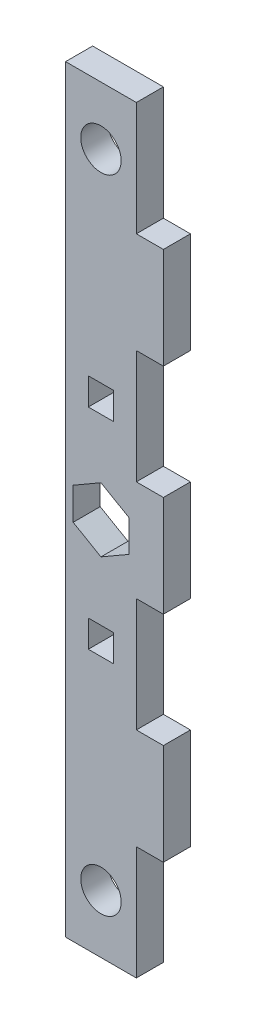
ISO-10303-21;
HEADER;
FILE_DESCRIPTION(('STEP AP214'),'2;1');
FILE_NAME('part.step','',(''),(''),'','','');
FILE_SCHEMA(('AUTOMOTIVE_DESIGN { 1 0 10303 214 1 1 1 1 }'));
ENDSEC;
DATA;
#1=APPLICATION_CONTEXT('core data for automotive mechanical design processes');
#2=APPLICATION_PROTOCOL_DEFINITION('international standard','automotive_design',2000,#1);
#3=PRODUCT_CONTEXT('',#1,'mechanical');
#4=PRODUCT('Part','Part','',(#3));
#5=PRODUCT_RELATED_PRODUCT_CATEGORY('part','',(#4));
#6=PRODUCT_DEFINITION_FORMATION('','',#4);
#7=PRODUCT_DEFINITION_CONTEXT('part definition',#1,'design');
#8=PRODUCT_DEFINITION('design','',#6,#7);
#9=PRODUCT_DEFINITION_SHAPE('','',#8);
#10=(LENGTH_UNIT() NAMED_UNIT(*) SI_UNIT(.MILLI.,.METRE.));
#11=(NAMED_UNIT(*) PLANE_ANGLE_UNIT() SI_UNIT($,.RADIAN.));
#12=(NAMED_UNIT(*) SI_UNIT($,.STERADIAN.) SOLID_ANGLE_UNIT());
#13=UNCERTAINTY_MEASURE_WITH_UNIT(LENGTH_MEASURE(1.E-05),#10,'distance_accuracy_value','');
#14=(GEOMETRIC_REPRESENTATION_CONTEXT(3) GLOBAL_UNCERTAINTY_ASSIGNED_CONTEXT((#13)) GLOBAL_UNIT_ASSIGNED_CONTEXT((#10,
#11,#12)) REPRESENTATION_CONTEXT('',''));
#15=CARTESIAN_POINT('',(0.,0.,0.));
#16=DIRECTION('',(0.,0.,1.));
#17=DIRECTION('',(1.,0.,0.));
#18=AXIS2_PLACEMENT_3D('',#15,#16,#17);
#19=CARTESIAN_POINT('',(0.,0.,5.35));
#20=DIRECTION('',(0.,0.,-1.));
#21=DIRECTION('',(-1.,0.,0.));
#22=AXIS2_PLACEMENT_3D('',#19,#20,#21);
#23=PLANE('',#22);
#24=DIRECTION('',(0.,1.,0.));
#25=VECTOR('',#24,1.);
#26=CARTESIAN_POINT('',(9.49999969450005,93.0749997497,5.35));
#27=LINE('',#26,#25);
#28=CARTESIAN_POINT('',(9.49999969450005,93.0749997497,5.35));
#29=VERTEX_POINT('',#28);
#30=CARTESIAN_POINT('',(9.49999969450005,98.425000906,5.35));
#31=VERTEX_POINT('',#30);
#32=EDGE_CURVE('E281',#29,#31,#27,.T.);
#33=ORIENTED_EDGE('',*,*,#32,.F.);
#34=DIRECTION('',(1.,0.,0.));
#35=VECTOR('',#34,1.);
#36=CARTESIAN_POINT('',(4.49999980630006,93.0749997497,5.35));
#37=LINE('',#36,#35);
#38=CARTESIAN_POINT('',(4.49999980630006,93.0749997497,5.35));
#39=VERTEX_POINT('',#38);
#40=EDGE_CURVE('E289',#39,#29,#37,.T.);
#41=ORIENTED_EDGE('',*,*,#40,.F.);
#42=DIRECTION('',(0.,-1.,0.));
#43=VECTOR('',#42,1.);
#44=CARTESIAN_POINT('',(4.49999980630006,98.425000906,5.35));
#45=LINE('',#44,#43);
#46=CARTESIAN_POINT('',(4.49999980630006,98.425000906,5.35));
#47=VERTEX_POINT('',#46);
#48=EDGE_CURVE('E286',#47,#39,#45,.T.);
#49=ORIENTED_EDGE('',*,*,#48,.F.);
#50=DIRECTION('',(-1.,0.,0.));
#51=VECTOR('',#50,1.);
#52=CARTESIAN_POINT('',(9.49999969450005,98.425000906,5.35));
#53=LINE('',#52,#51);
#54=EDGE_CURVE('E283',#31,#47,#53,.T.);
#55=ORIENTED_EDGE('',*,*,#54,.F.);
#56=EDGE_LOOP('',(#33,#41,#49,#55));
#57=FACE_BOUND('',#56,.T.);
#58=CARTESIAN_POINT('',(7.00000000000006,138.5,5.35));
#59=DIRECTION('',(0.,0.,1.));
#60=DIRECTION('',(1.,0.,0.));
#61=AXIS2_PLACEMENT_3D('',#58,#59,#60);
#62=CIRCLE('',#61,4.);
#63=CARTESIAN_POINT('',(11.0000000000001,138.5,5.35));
#64=VERTEX_POINT('',#63);
#65=EDGE_CURVE('E343',#64,#64,#62,.T.);
#66=ORIENTED_EDGE('',*,*,#65,.F.);
#67=EDGE_LOOP('',(#66));
#68=FACE_BOUND('',#67,.T.);
#69=CARTESIAN_POINT('',(7.00000000000006,11.5,5.35));
#70=DIRECTION('',(0.,0.,1.));
#71=DIRECTION('',(1.,0.,0.));
#72=AXIS2_PLACEMENT_3D('',#69,#70,#71);
#73=CIRCLE('',#72,4.);
#74=CARTESIAN_POINT('',(11.0000000000001,11.5,5.35));
#75=VERTEX_POINT('',#74);
#76=EDGE_CURVE('E349',#75,#75,#73,.T.);
#77=ORIENTED_EDGE('',*,*,#76,.F.);
#78=EDGE_LOOP('',(#77));
#79=FACE_BOUND('',#78,.T.);
#80=DIRECTION('',(-1.,0.,0.));
#81=VECTOR('',#80,1.);
#82=CARTESIAN_POINT('',(19.3499997258,127.4999976158,5.35));
#83=LINE('',#82,#81);
#84=CARTESIAN_POINT('',(19.3499997258,127.4999976158,5.35));
#85=VERTEX_POINT('',#84);
#86=CARTESIAN_POINT('',(14.0000004321001,127.4999976158,5.35));
#87=VERTEX_POINT('',#86);
#88=EDGE_CURVE('E355',#85,#87,#83,.T.);
#89=ORIENTED_EDGE('',*,*,#88,.T.);
#90=DIRECTION('',(0.,1.,0.));
#91=VECTOR('',#90,1.);
#92=CARTESIAN_POINT('',(14.0000004321001,127.4999976158,5.35));
#93=LINE('',#92,#91);
#94=CARTESIAN_POINT('',(14.0000004321001,150.0000059605,5.35));
#95=VERTEX_POINT('',#94);
#96=EDGE_CURVE('E358',#87,#95,#93,.T.);
#97=ORIENTED_EDGE('',*,*,#96,.T.);
#98=DIRECTION('',(-1.,0.,0.));
#99=VECTOR('',#98,1.);
#100=CARTESIAN_POINT('',(14.0000004321001,150.0000059605,5.35));
#101=LINE('',#100,#99);
#102=CARTESIAN_POINT('',(0.,150.0000059605,5.35));
#103=VERTEX_POINT('',#102);
#104=EDGE_CURVE('E361',#95,#103,#101,.T.);
#105=ORIENTED_EDGE('',*,*,#104,.T.);
#106=DIRECTION('',(0.,-1.,0.));
#107=VECTOR('',#106,1.);
#108=CARTESIAN_POINT('',(0.,150.0000059605,5.35));
#109=LINE('',#108,#107);
#110=CARTESIAN_POINT('',(0.,0.,5.35));
#111=VERTEX_POINT('',#110);
#112=EDGE_CURVE('E363',#103,#111,#109,.T.);
#113=ORIENTED_EDGE('',*,*,#112,.T.);
#114=DIRECTION('',(1.,0.,0.));
#115=VECTOR('',#114,1.);
#116=CARTESIAN_POINT('',(0.,0.,5.35));
#117=LINE('',#116,#115);
#118=CARTESIAN_POINT('',(14.0000004321001,0.,5.35));
#119=VERTEX_POINT('',#118);
#120=EDGE_CURVE('E365',#111,#119,#117,.T.);
#121=ORIENTED_EDGE('',*,*,#120,.T.);
#122=DIRECTION('',(0.,1.,0.));
#123=VECTOR('',#122,1.);
#124=CARTESIAN_POINT('',(14.0000004321001,0.,5.35));
#125=LINE('',#124,#123);
#126=CARTESIAN_POINT('',(14.0000004321001,22.5000008941,5.35));
#127=VERTEX_POINT('',#126);
#128=EDGE_CURVE('E367',#119,#127,#125,.T.);
#129=ORIENTED_EDGE('',*,*,#128,.T.);
#130=DIRECTION('',(1.,0.,0.));
#131=VECTOR('',#130,1.);
#132=CARTESIAN_POINT('',(14.0000004321001,22.5000008941,5.35));
#133=LINE('',#132,#131);
#134=CARTESIAN_POINT('',(19.3499997258,22.5000008941,5.35));
#135=VERTEX_POINT('',#134);
#136=EDGE_CURVE('E369',#127,#135,#133,.T.);
#137=ORIENTED_EDGE('',*,*,#136,.T.);
#138=DIRECTION('',(0.,1.,0.));
#139=VECTOR('',#138,1.);
#140=CARTESIAN_POINT('',(19.3499997258,22.5000008941,5.35));
#141=LINE('',#140,#139);
#142=CARTESIAN_POINT('',(19.3499997258,42.500000447,5.35));
#143=VERTEX_POINT('',#142);
#144=EDGE_CURVE('E371',#135,#143,#141,.T.);
#145=ORIENTED_EDGE('',*,*,#144,.T.);
#146=DIRECTION('',(-1.,0.,0.));
#147=VECTOR('',#146,1.);
#148=CARTESIAN_POINT('',(19.3499997258,42.500000447,5.35));
#149=LINE('',#148,#147);
#150=CARTESIAN_POINT('',(14.0000004321001,42.500000447,5.35));
#151=VERTEX_POINT('',#150);
#152=EDGE_CURVE('E373',#143,#151,#149,.T.);
#153=ORIENTED_EDGE('',*,*,#152,.T.);
#154=DIRECTION('',(0.,1.,0.));
#155=VECTOR('',#154,1.);
#156=CARTESIAN_POINT('',(14.0000004321001,42.500000447,5.35));
#157=LINE('',#156,#155);
#158=CARTESIAN_POINT('',(14.0000004321001,64.9999976158,5.35));
#159=VERTEX_POINT('',#158);
#160=EDGE_CURVE('E375',#151,#159,#157,.T.);
#161=ORIENTED_EDGE('',*,*,#160,.T.);
#162=DIRECTION('',(1.,0.,0.));
#163=VECTOR('',#162,1.);
#164=CARTESIAN_POINT('',(14.0000004321001,64.9999976158,5.35));
#165=LINE('',#164,#163);
#166=CARTESIAN_POINT('',(19.3499997258,64.9999976158,5.35));
#167=VERTEX_POINT('',#166);
#168=EDGE_CURVE('E377',#159,#167,#165,.T.);
#169=ORIENTED_EDGE('',*,*,#168,.T.);
#170=DIRECTION('',(0.,1.,0.));
#171=VECTOR('',#170,1.);
#172=CARTESIAN_POINT('',(19.3499997258,64.9999976158,5.35));
#173=LINE('',#172,#171);
#174=CARTESIAN_POINT('',(19.3499997258,85.0000008941,5.35));
#175=VERTEX_POINT('',#174);
#176=EDGE_CURVE('E379',#167,#175,#173,.T.);
#177=ORIENTED_EDGE('',*,*,#176,.T.);
#178=DIRECTION('',(-1.,0.,0.));
#179=VECTOR('',#178,1.);
#180=CARTESIAN_POINT('',(19.3499997258,85.0000008941,5.35));
#181=LINE('',#180,#179);
#182=CARTESIAN_POINT('',(14.0000004321001,85.0000008941,5.35));
#183=VERTEX_POINT('',#182);
#184=EDGE_CURVE('E381',#175,#183,#181,.T.);
#185=ORIENTED_EDGE('',*,*,#184,.T.);
#186=DIRECTION('',(0.,1.,0.));
#187=VECTOR('',#186,1.);
#188=CARTESIAN_POINT('',(14.0000004321001,85.0000008941,5.35));
#189=LINE('',#188,#187);
#190=CARTESIAN_POINT('',(14.0000004321001,107.5000017881,5.35));
#191=VERTEX_POINT('',#190);
#192=EDGE_CURVE('E383',#183,#191,#189,.T.);
#193=ORIENTED_EDGE('',*,*,#192,.T.);
#194=DIRECTION('',(1.,0.,0.));
#195=VECTOR('',#194,1.);
#196=CARTESIAN_POINT('',(14.0000004321001,107.5000017881,5.35));
#197=LINE('',#196,#195);
#198=CARTESIAN_POINT('',(19.3499997258,107.5000017881,5.35));
#199=VERTEX_POINT('',#198);
#200=EDGE_CURVE('E385',#191,#199,#197,.T.);
#201=ORIENTED_EDGE('',*,*,#200,.T.);
#202=DIRECTION('',(0.,1.,0.));
#203=VECTOR('',#202,1.);
#204=CARTESIAN_POINT('',(19.3499997258,107.5000017881,5.35));
#205=LINE('',#204,#203);
#206=EDGE_CURVE('E387',#199,#85,#205,.T.);
#207=ORIENTED_EDGE('',*,*,#206,.T.);
#208=EDGE_LOOP('',(#89,#97,#105,#113,#121,#129,#137,#145,#153,#161,#169,#177,#185,#193,#201,#207));
#209=FACE_BOUND('',#208,.T.);
#210=DIRECTION('',(0.,-1.,0.));
#211=VECTOR('',#210,1.);
#212=CARTESIAN_POINT('',(4.49999980630006,56.9249987602,5.35));
#213=LINE('',#212,#211);
#214=CARTESIAN_POINT('',(4.49999980630006,56.9249987602,5.35));
#215=VERTEX_POINT('',#214);
#216=CARTESIAN_POINT('',(4.49999980630006,51.5750013292,5.35));
#217=VERTEX_POINT('',#216);
#218=EDGE_CURVE('E312',#215,#217,#213,.T.);
#219=ORIENTED_EDGE('',*,*,#218,.F.);
#220=DIRECTION('',(-1.,0.,0.));
#221=VECTOR('',#220,1.);
#222=CARTESIAN_POINT('',(9.49999969450005,56.9249987602,5.35));
#223=LINE('',#222,#221);
#224=CARTESIAN_POINT('',(9.49999969450005,56.9249987602,5.35));
#225=VERTEX_POINT('',#224);
#226=EDGE_CURVE('E320',#225,#215,#223,.T.);
#227=ORIENTED_EDGE('',*,*,#226,.F.);
#228=DIRECTION('',(0.,1.,0.));
#229=VECTOR('',#228,1.);
#230=CARTESIAN_POINT('',(9.49999969450005,51.5750013292,5.35));
#231=LINE('',#230,#229);
#232=CARTESIAN_POINT('',(9.49999969450005,51.5750013292,5.35));
#233=VERTEX_POINT('',#232);
#234=EDGE_CURVE('E317',#233,#225,#231,.T.);
#235=ORIENTED_EDGE('',*,*,#234,.F.);
#236=DIRECTION('',(1.,0.,0.));
#237=VECTOR('',#236,1.);
#238=CARTESIAN_POINT('',(4.49999980630006,51.5750013292,5.35));
#239=LINE('',#238,#237);
#240=EDGE_CURVE('E314',#217,#233,#239,.T.);
#241=ORIENTED_EDGE('',*,*,#240,.F.);
#242=EDGE_LOOP('',(#219,#227,#235,#241));
#243=FACE_BOUND('',#242,.T.);
#244=DIRECTION('',(0.,-1.,0.));
#245=VECTOR('',#244,1.);
#246=CARTESIAN_POINT('',(1.50000001299999,78.1754255295,5.35));
#247=LINE('',#246,#245);
#248=CARTESIAN_POINT('',(1.50000001299999,78.1754255295,5.35));
#249=VERTEX_POINT('',#248);
#250=CARTESIAN_POINT('',(1.50000001299999,71.8245729804,5.35));
#251=VERTEX_POINT('',#250);
#252=EDGE_CURVE('E230',#249,#251,#247,.T.);
#253=ORIENTED_EDGE('',*,*,#252,.F.);
#254=DIRECTION('',(-0.86602517183006,-0.500000401756554,0.));
#255=VECTOR('',#254,1.);
#256=CARTESIAN_POINT('',(7.00000021610003,81.3508555293,5.35));
#257=LINE('',#256,#255);
#258=CARTESIAN_POINT('',(7.00000021610003,81.3508555293,5.35));
#259=VERTEX_POINT('',#258);
#260=EDGE_CURVE('E259',#259,#249,#257,.T.);
#261=ORIENTED_EDGE('',*,*,#260,.F.);
#262=DIRECTION('',(-0.866025162661986,0.500000417636106,0.));
#263=VECTOR('',#262,1.);
#264=CARTESIAN_POINT('',(12.5000001863,78.1754255295,5.35));
#265=LINE('',#264,#263);
#266=CARTESIAN_POINT('',(12.5000001863,78.1754255295,5.35));
#267=VERTEX_POINT('',#266);
#268=EDGE_CURVE('E257',#267,#259,#265,.T.);
#269=ORIENTED_EDGE('',*,*,#268,.F.);
#270=DIRECTION('',(0.,1.,0.));
#271=VECTOR('',#270,1.);
#272=CARTESIAN_POINT('',(12.5000001863,71.8245729804,5.35));
#273=LINE('',#272,#271);
#274=CARTESIAN_POINT('',(12.5000001863,71.8245729804,5.35));
#275=VERTEX_POINT('',#274);
#276=EDGE_CURVE('E253',#275,#267,#273,.T.);
#277=ORIENTED_EDGE('',*,*,#276,.F.);
#278=DIRECTION('',(0.866025670657436,0.499999537762125,0.));
#279=VECTOR('',#278,1.);
#280=CARTESIAN_POINT('',(7.00000021610009,68.6491504312,5.35));
#281=LINE('',#280,#279);
#282=CARTESIAN_POINT('',(7.00000021610009,68.6491504312,5.35));
#283=VERTEX_POINT('',#282);
#284=EDGE_CURVE('E251',#283,#275,#281,.T.);
#285=ORIENTED_EDGE('',*,*,#284,.F.);
#286=DIRECTION('',(0.866025679825487,-0.499999521882575,0.));
#287=VECTOR('',#286,1.);
#288=CARTESIAN_POINT('',(1.50000001299999,71.8245729804,5.35));
#289=LINE('',#288,#287);
#290=EDGE_CURVE('E238',#251,#283,#289,.T.);
#291=ORIENTED_EDGE('',*,*,#290,.F.);
#292=EDGE_LOOP('',(#253,#261,#269,#277,#285,#291));
#293=FACE_BOUND('',#292,.T.);
#294=ADVANCED_FACE('F33',(#57,#68,#79,#209,#243,#293),#23,.F.);
#295=CARTESIAN_POINT('',(0.,0.,0.));
#296=DIRECTION('',(0.,0.,-1.));
#297=DIRECTION('',(-1.,0.,0.));
#298=AXIS2_PLACEMENT_3D('',#295,#296,#297);
#299=PLANE('',#298);
#300=CARTESIAN_POINT('',(7.00000000000006,11.5,0.));
#301=DIRECTION('',(0.,0.,1.));
#302=DIRECTION('',(1.,0.,0.));
#303=AXIS2_PLACEMENT_3D('',#300,#301,#302);
#304=CIRCLE('',#303,4.);
#305=CARTESIAN_POINT('',(11.0000000000001,11.5,0.));
#306=VERTEX_POINT('',#305);
#307=EDGE_CURVE('E346',#306,#306,#304,.T.);
#308=ORIENTED_EDGE('',*,*,#307,.T.);
#309=EDGE_LOOP('',(#308));
#310=FACE_BOUND('',#309,.T.);
#311=DIRECTION('',(-1.,0.,0.));
#312=VECTOR('',#311,1.);
#313=CARTESIAN_POINT('',(19.3499997258,127.4999976158,0.));
#314=LINE('',#313,#312);
#315=CARTESIAN_POINT('',(19.3499997258,127.4999976158,0.));
#316=VERTEX_POINT('',#315);
#317=CARTESIAN_POINT('',(14.0000004321001,127.4999976158,0.));
#318=VERTEX_POINT('',#317);
#319=EDGE_CURVE('E352',#316,#318,#314,.T.);
#320=ORIENTED_EDGE('',*,*,#319,.F.);
#321=DIRECTION('',(0.,1.,0.));
#322=VECTOR('',#321,1.);
#323=CARTESIAN_POINT('',(19.3499997258,107.5000017881,0.));
#324=LINE('',#323,#322);
#325=CARTESIAN_POINT('',(19.3499997258,107.5000017881,0.));
#326=VERTEX_POINT('',#325);
#327=EDGE_CURVE('E359',#326,#316,#324,.T.);
#328=ORIENTED_EDGE('',*,*,#327,.F.);
#329=DIRECTION('',(1.,0.,0.));
#330=VECTOR('',#329,1.);
#331=CARTESIAN_POINT('',(14.0000004321001,107.5000017881,0.));
#332=LINE('',#331,#330);
#333=CARTESIAN_POINT('',(14.0000004321001,107.5000017881,0.));
#334=VERTEX_POINT('',#333);
#335=EDGE_CURVE('E418',#334,#326,#332,.T.);
#336=ORIENTED_EDGE('',*,*,#335,.F.);
#337=DIRECTION('',(0.,1.,0.));
#338=VECTOR('',#337,1.);
#339=CARTESIAN_POINT('',(14.0000004321001,85.0000008941,0.));
#340=LINE('',#339,#338);
#341=CARTESIAN_POINT('',(14.0000004321001,85.0000008941,0.));
#342=VERTEX_POINT('',#341);
#343=EDGE_CURVE('E416',#342,#334,#340,.T.);
#344=ORIENTED_EDGE('',*,*,#343,.F.);
#345=DIRECTION('',(-1.,0.,0.));
#346=VECTOR('',#345,1.);
#347=CARTESIAN_POINT('',(19.3499997258,85.0000008941,0.));
#348=LINE('',#347,#346);
#349=CARTESIAN_POINT('',(19.3499997258,85.0000008941,0.));
#350=VERTEX_POINT('',#349);
#351=EDGE_CURVE('E414',#350,#342,#348,.T.);
#352=ORIENTED_EDGE('',*,*,#351,.F.);
#353=DIRECTION('',(0.,1.,0.));
#354=VECTOR('',#353,1.);
#355=CARTESIAN_POINT('',(19.3499997258,64.9999976158,0.));
#356=LINE('',#355,#354);
#357=CARTESIAN_POINT('',(19.3499997258,64.9999976158,0.));
#358=VERTEX_POINT('',#357);
#359=EDGE_CURVE('E412',#358,#350,#356,.T.);
#360=ORIENTED_EDGE('',*,*,#359,.F.);
#361=DIRECTION('',(1.,0.,0.));
#362=VECTOR('',#361,1.);
#363=CARTESIAN_POINT('',(14.0000004321001,64.9999976158,0.));
#364=LINE('',#363,#362);
#365=CARTESIAN_POINT('',(14.0000004321001,64.9999976158,0.));
#366=VERTEX_POINT('',#365);
#367=EDGE_CURVE('E410',#366,#358,#364,.T.);
#368=ORIENTED_EDGE('',*,*,#367,.F.);
#369=DIRECTION('',(0.,1.,0.));
#370=VECTOR('',#369,1.);
#371=CARTESIAN_POINT('',(14.0000004321001,42.500000447,0.));
#372=LINE('',#371,#370);
#373=CARTESIAN_POINT('',(14.0000004321001,42.500000447,0.));
#374=VERTEX_POINT('',#373);
#375=EDGE_CURVE('E408',#374,#366,#372,.T.);
#376=ORIENTED_EDGE('',*,*,#375,.F.);
#377=DIRECTION('',(-1.,0.,0.));
#378=VECTOR('',#377,1.);
#379=CARTESIAN_POINT('',(19.3499997258,42.500000447,0.));
#380=LINE('',#379,#378);
#381=CARTESIAN_POINT('',(19.3499997258,42.500000447,0.));
#382=VERTEX_POINT('',#381);
#383=EDGE_CURVE('E406',#382,#374,#380,.T.);
#384=ORIENTED_EDGE('',*,*,#383,.F.);
#385=DIRECTION('',(0.,1.,0.));
#386=VECTOR('',#385,1.);
#387=CARTESIAN_POINT('',(19.3499997258,22.5000008941,0.));
#388=LINE('',#387,#386);
#389=CARTESIAN_POINT('',(19.3499997258,22.5000008941,0.));
#390=VERTEX_POINT('',#389);
#391=EDGE_CURVE('E404',#390,#382,#388,.T.);
#392=ORIENTED_EDGE('',*,*,#391,.F.);
#393=DIRECTION('',(1.,0.,0.));
#394=VECTOR('',#393,1.);
#395=CARTESIAN_POINT('',(14.0000004321001,22.5000008941,0.));
#396=LINE('',#395,#394);
#397=CARTESIAN_POINT('',(14.0000004321001,22.5000008941,0.));
#398=VERTEX_POINT('',#397);
#399=EDGE_CURVE('E402',#398,#390,#396,.T.);
#400=ORIENTED_EDGE('',*,*,#399,.F.);
#401=DIRECTION('',(0.,1.,0.));
#402=VECTOR('',#401,1.);
#403=CARTESIAN_POINT('',(14.0000004321001,0.,0.));
#404=LINE('',#403,#402);
#405=CARTESIAN_POINT('',(14.0000004321001,0.,0.));
#406=VERTEX_POINT('',#405);
#407=EDGE_CURVE('E400',#406,#398,#404,.T.);
#408=ORIENTED_EDGE('',*,*,#407,.F.);
#409=DIRECTION('',(1.,0.,0.));
#410=VECTOR('',#409,1.);
#411=CARTESIAN_POINT('',(0.,0.,0.));
#412=LINE('',#411,#410);
#413=CARTESIAN_POINT('',(0.,0.,0.));
#414=VERTEX_POINT('',#413);
#415=EDGE_CURVE('E398',#414,#406,#412,.T.);
#416=ORIENTED_EDGE('',*,*,#415,.F.);
#417=DIRECTION('',(0.,-1.,0.));
#418=VECTOR('',#417,1.);
#419=CARTESIAN_POINT('',(0.,150.0000059605,0.));
#420=LINE('',#419,#418);
#421=CARTESIAN_POINT('',(0.,150.0000059605,0.));
#422=VERTEX_POINT('',#421);
#423=EDGE_CURVE('E396',#422,#414,#420,.T.);
#424=ORIENTED_EDGE('',*,*,#423,.F.);
#425=DIRECTION('',(-1.,0.,0.));
#426=VECTOR('',#425,1.);
#427=CARTESIAN_POINT('',(14.0000004321001,150.0000059605,0.));
#428=LINE('',#427,#426);
#429=CARTESIAN_POINT('',(14.0000004321001,150.0000059605,0.));
#430=VERTEX_POINT('',#429);
#431=EDGE_CURVE('E394',#430,#422,#428,.T.);
#432=ORIENTED_EDGE('',*,*,#431,.F.);
#433=DIRECTION('',(0.,1.,0.));
#434=VECTOR('',#433,1.);
#435=CARTESIAN_POINT('',(14.0000004321001,127.4999976158,0.));
#436=LINE('',#435,#434);
#437=EDGE_CURVE('E392',#318,#430,#436,.T.);
#438=ORIENTED_EDGE('',*,*,#437,.F.);
#439=EDGE_LOOP('',(#320,#328,#336,#344,#352,#360,#368,#376,#384,#392,#400,#408,#416,#424,#432,#438));
#440=FACE_BOUND('',#439,.T.);
#441=CARTESIAN_POINT('',(7.00000000000006,138.5,0.));
#442=DIRECTION('',(0.,0.,1.));
#443=DIRECTION('',(1.,0.,0.));
#444=AXIS2_PLACEMENT_3D('',#441,#442,#443);
#445=CIRCLE('',#444,4.);
#446=CARTESIAN_POINT('',(11.0000000000001,138.5,0.));
#447=VERTEX_POINT('',#446);
#448=EDGE_CURVE('E342',#447,#447,#445,.T.);
#449=ORIENTED_EDGE('',*,*,#448,.T.);
#450=EDGE_LOOP('',(#449));
#451=FACE_BOUND('',#450,.T.);
#452=DIRECTION('',(-1.,0.,0.));
#453=VECTOR('',#452,1.);
#454=CARTESIAN_POINT('',(9.49999969450005,56.9249987602,0.));
#455=LINE('',#454,#453);
#456=CARTESIAN_POINT('',(9.49999969450005,56.9249987602,0.));
#457=VERTEX_POINT('',#456);
#458=CARTESIAN_POINT('',(4.49999980630006,56.9249987602,0.));
#459=VERTEX_POINT('',#458);
#460=EDGE_CURVE('E315',#457,#459,#455,.T.);
#461=ORIENTED_EDGE('',*,*,#460,.T.);
#462=DIRECTION('',(0.,-1.,0.));
#463=VECTOR('',#462,1.);
#464=CARTESIAN_POINT('',(4.49999980630006,56.9249987602,0.));
#465=LINE('',#464,#463);
#466=CARTESIAN_POINT('',(4.49999980630006,51.5750013292,0.));
#467=VERTEX_POINT('',#466);
#468=EDGE_CURVE('E311',#459,#467,#465,.T.);
#469=ORIENTED_EDGE('',*,*,#468,.T.);
#470=DIRECTION('',(1.,0.,0.));
#471=VECTOR('',#470,1.);
#472=CARTESIAN_POINT('',(4.49999980630006,51.5750013292,0.));
#473=LINE('',#472,#471);
#474=CARTESIAN_POINT('',(9.49999969450005,51.5750013292,0.));
#475=VERTEX_POINT('',#474);
#476=EDGE_CURVE('E325',#467,#475,#473,.T.);
#477=ORIENTED_EDGE('',*,*,#476,.T.);
#478=DIRECTION('',(0.,1.,0.));
#479=VECTOR('',#478,1.);
#480=CARTESIAN_POINT('',(9.49999969450005,51.5750013292,0.));
#481=LINE('',#480,#479);
#482=EDGE_CURVE('E328',#475,#457,#481,.T.);
#483=ORIENTED_EDGE('',*,*,#482,.T.);
#484=EDGE_LOOP('',(#461,#469,#477,#483));
#485=FACE_BOUND('',#484,.T.);
#486=DIRECTION('',(1.,0.,0.));
#487=VECTOR('',#486,1.);
#488=CARTESIAN_POINT('',(4.49999980630006,93.0749997497,0.));
#489=LINE('',#488,#487);
#490=CARTESIAN_POINT('',(4.49999980630006,93.0749997497,0.));
#491=VERTEX_POINT('',#490);
#492=CARTESIAN_POINT('',(9.49999969450005,93.0749997497,0.));
#493=VERTEX_POINT('',#492);
#494=EDGE_CURVE('E284',#491,#493,#489,.T.);
#495=ORIENTED_EDGE('',*,*,#494,.T.);
#496=DIRECTION('',(0.,1.,0.));
#497=VECTOR('',#496,1.);
#498=CARTESIAN_POINT('',(9.49999969450005,93.0749997497,0.));
#499=LINE('',#498,#497);
#500=CARTESIAN_POINT('',(9.49999969450005,98.425000906,0.));
#501=VERTEX_POINT('',#500);
#502=EDGE_CURVE('E246',#493,#501,#499,.T.);
#503=ORIENTED_EDGE('',*,*,#502,.T.);
#504=DIRECTION('',(-1.,0.,0.));
#505=VECTOR('',#504,1.);
#506=CARTESIAN_POINT('',(9.49999969450005,98.425000906,0.));
#507=LINE('',#506,#505);
#508=CARTESIAN_POINT('',(4.49999980630006,98.425000906,0.));
#509=VERTEX_POINT('',#508);
#510=EDGE_CURVE('E294',#501,#509,#507,.T.);
#511=ORIENTED_EDGE('',*,*,#510,.T.);
#512=DIRECTION('',(0.,-1.,0.));
#513=VECTOR('',#512,1.);
#514=CARTESIAN_POINT('',(4.49999980630006,98.425000906,0.));
#515=LINE('',#514,#513);
#516=EDGE_CURVE('E297',#509,#491,#515,.T.);
#517=ORIENTED_EDGE('',*,*,#516,.T.);
#518=EDGE_LOOP('',(#495,#503,#511,#517));
#519=FACE_BOUND('',#518,.T.);
#520=DIRECTION('',(-0.86602517183006,-0.500000401756554,0.));
#521=VECTOR('',#520,1.);
#522=CARTESIAN_POINT('',(7.00000021610003,81.3508555293,0.));
#523=LINE('',#522,#521);
#524=CARTESIAN_POINT('',(7.00000021610003,81.3508555293,0.));
#525=VERTEX_POINT('',#524);
#526=CARTESIAN_POINT('',(1.50000001299999,78.1754255295,0.));
#527=VERTEX_POINT('',#526);
#528=EDGE_CURVE('E239',#525,#527,#523,.T.);
#529=ORIENTED_EDGE('',*,*,#528,.T.);
#530=DIRECTION('',(0.,-1.,0.));
#531=VECTOR('',#530,1.);
#532=CARTESIAN_POINT('',(1.50000001299999,78.1754255295,0.));
#533=LINE('',#532,#531);
#534=CARTESIAN_POINT('',(1.50000001299999,71.8245729804,0.));
#535=VERTEX_POINT('',#534);
#536=EDGE_CURVE('E56',#527,#535,#533,.T.);
#537=ORIENTED_EDGE('',*,*,#536,.T.);
#538=DIRECTION('',(0.866025679825487,-0.499999521882575,0.));
#539=VECTOR('',#538,1.);
#540=CARTESIAN_POINT('',(1.50000001299999,71.8245729804,0.));
#541=LINE('',#540,#539);
#542=CARTESIAN_POINT('',(7.00000021610009,68.6491504312,0.));
#543=VERTEX_POINT('',#542);
#544=EDGE_CURVE('E245',#535,#543,#541,.T.);
#545=ORIENTED_EDGE('',*,*,#544,.T.);
#546=DIRECTION('',(0.866025670657436,0.499999537762125,0.));
#547=VECTOR('',#546,1.);
#548=CARTESIAN_POINT('',(7.00000021610009,68.6491504312,0.));
#549=LINE('',#548,#547);
#550=CARTESIAN_POINT('',(12.5000001863,71.8245729804,0.));
#551=VERTEX_POINT('',#550);
#552=EDGE_CURVE('E263',#543,#551,#549,.T.);
#553=ORIENTED_EDGE('',*,*,#552,.T.);
#554=DIRECTION('',(0.,1.,0.));
#555=VECTOR('',#554,1.);
#556=CARTESIAN_POINT('',(12.5000001863,71.8245729804,0.));
#557=LINE('',#556,#555);
#558=CARTESIAN_POINT('',(12.5000001863,78.1754255295,0.));
#559=VERTEX_POINT('',#558);
#560=EDGE_CURVE('E266',#551,#559,#557,.T.);
#561=ORIENTED_EDGE('',*,*,#560,.T.);
#562=DIRECTION('',(-0.866025162661986,0.500000417636106,0.));
#563=VECTOR('',#562,1.);
#564=CARTESIAN_POINT('',(12.5000001863,78.1754255295,0.));
#565=LINE('',#564,#563);
#566=EDGE_CURVE('E269',#559,#525,#565,.T.);
#567=ORIENTED_EDGE('',*,*,#566,.T.);
#568=EDGE_LOOP('',(#529,#537,#545,#553,#561,#567));
#569=FACE_BOUND('',#568,.T.);
#570=ADVANCED_FACE('F472',(#310,#440,#451,#485,#519,#569),#299,.T.);
#571=CARTESIAN_POINT('',(19.3499997258,127.4999976158,5.35));
#572=DIRECTION('',(0.,-1.,0.));
#573=DIRECTION('',(0.,0.,-1.));
#574=AXIS2_PLACEMENT_3D('',#571,#572,#573);
#575=PLANE('',#574);
#576=ORIENTED_EDGE('',*,*,#319,.T.);
#577=DIRECTION('',(0.,0.,-1.));
#578=VECTOR('',#577,1.);
#579=CARTESIAN_POINT('',(14.0000004321001,127.4999976158,5.35));
#580=LINE('',#579,#578);
#581=EDGE_CURVE('E11',#87,#318,#580,.T.);
#582=ORIENTED_EDGE('',*,*,#581,.F.);
#583=ORIENTED_EDGE('',*,*,#88,.F.);
#584=DIRECTION('',(0.,0.,-1.));
#585=VECTOR('',#584,1.);
#586=CARTESIAN_POINT('',(19.3499997258,127.4999976158,5.35));
#587=LINE('',#586,#585);
#588=EDGE_CURVE('E389',#85,#316,#587,.T.);
#589=ORIENTED_EDGE('',*,*,#588,.T.);
#590=EDGE_LOOP('',(#576,#582,#583,#589));
#591=FACE_BOUND('',#590,.T.);
#592=ADVANCED_FACE('F35',(#591),#575,.F.);
#593=CARTESIAN_POINT('',(14.0000004321001,127.4999976158,5.35));
#594=DIRECTION('',(-1.,0.,0.));
#595=DIRECTION('',(0.,0.,1.));
#596=AXIS2_PLACEMENT_3D('',#593,#594,#595);
#597=PLANE('',#596);
#598=ORIENTED_EDGE('',*,*,#437,.T.);
#599=DIRECTION('',(0.,0.,-1.));
#600=VECTOR('',#599,1.);
#601=CARTESIAN_POINT('',(14.0000004321001,150.0000059605,5.35));
#602=LINE('',#601,#600);
#603=EDGE_CURVE('E41',#95,#430,#602,.T.);
#604=ORIENTED_EDGE('',*,*,#603,.F.);
#605=ORIENTED_EDGE('',*,*,#96,.F.);
#606=ORIENTED_EDGE('',*,*,#581,.T.);
#607=EDGE_LOOP('',(#598,#604,#605,#606));
#608=FACE_BOUND('',#607,.T.);
#609=ADVANCED_FACE('F490',(#608),#597,.F.);
#610=CARTESIAN_POINT('',(14.0000004321001,150.0000059605,5.35));
#611=DIRECTION('',(0.,-1.,0.));
#612=DIRECTION('',(0.,0.,-1.));
#613=AXIS2_PLACEMENT_3D('',#610,#611,#612);
#614=PLANE('',#613);
#615=ORIENTED_EDGE('',*,*,#431,.T.);
#616=DIRECTION('',(0.,0.,-1.));
#617=VECTOR('',#616,1.);
#618=CARTESIAN_POINT('',(0.,150.0000059605,5.35));
#619=LINE('',#618,#617);
#620=EDGE_CURVE('E459',#103,#422,#619,.T.);
#621=ORIENTED_EDGE('',*,*,#620,.F.);
#622=ORIENTED_EDGE('',*,*,#104,.F.);
#623=ORIENTED_EDGE('',*,*,#603,.T.);
#624=EDGE_LOOP('',(#615,#621,#622,#623));
#625=FACE_BOUND('',#624,.T.);
#626=ADVANCED_FACE('F466',(#625),#614,.F.);
#627=CARTESIAN_POINT('',(0.,150.0000059605,5.35));
#628=DIRECTION('',(1.,0.,0.));
#629=DIRECTION('',(0.,0.,-1.));
#630=AXIS2_PLACEMENT_3D('',#627,#628,#629);
#631=PLANE('',#630);
#632=ORIENTED_EDGE('',*,*,#423,.T.);
#633=DIRECTION('',(0.,0.,-1.));
#634=VECTOR('',#633,1.);
#635=CARTESIAN_POINT('',(0.,0.,5.35));
#636=LINE('',#635,#634);
#637=EDGE_CURVE('E456',#111,#414,#636,.T.);
#638=ORIENTED_EDGE('',*,*,#637,.F.);
#639=ORIENTED_EDGE('',*,*,#112,.F.);
#640=ORIENTED_EDGE('',*,*,#620,.T.);
#641=EDGE_LOOP('',(#632,#638,#639,#640));
#642=FACE_BOUND('',#641,.T.);
#643=ADVANCED_FACE('F478',(#642),#631,.F.);
#644=CARTESIAN_POINT('',(0.,0.,5.35));
#645=DIRECTION('',(0.,1.,0.));
#646=DIRECTION('',(0.,0.,1.));
#647=AXIS2_PLACEMENT_3D('',#644,#645,#646);
#648=PLANE('',#647);
#649=ORIENTED_EDGE('',*,*,#415,.T.);
#650=DIRECTION('',(0.,0.,-1.));
#651=VECTOR('',#650,1.);
#652=CARTESIAN_POINT('',(14.0000004321001,0.,5.35));
#653=LINE('',#652,#651);
#654=EDGE_CURVE('E453',#119,#406,#653,.T.);
#655=ORIENTED_EDGE('',*,*,#654,.F.);
#656=ORIENTED_EDGE('',*,*,#120,.F.);
#657=ORIENTED_EDGE('',*,*,#637,.T.);
#658=EDGE_LOOP('',(#649,#655,#656,#657));
#659=FACE_BOUND('',#658,.T.);
#660=ADVANCED_FACE('F482',(#659),#648,.F.);
#661=CARTESIAN_POINT('',(14.0000004321001,0.,5.35));
#662=DIRECTION('',(-1.,0.,0.));
#663=DIRECTION('',(0.,0.,1.));
#664=AXIS2_PLACEMENT_3D('',#661,#662,#663);
#665=PLANE('',#664);
#666=ORIENTED_EDGE('',*,*,#407,.T.);
#667=DIRECTION('',(0.,0.,-1.));
#668=VECTOR('',#667,1.);
#669=CARTESIAN_POINT('',(14.0000004321001,22.5000008941,5.35));
#670=LINE('',#669,#668);
#671=EDGE_CURVE('E450',#127,#398,#670,.T.);
#672=ORIENTED_EDGE('',*,*,#671,.F.);
#673=ORIENTED_EDGE('',*,*,#128,.F.);
#674=ORIENTED_EDGE('',*,*,#654,.T.);
#675=EDGE_LOOP('',(#666,#672,#673,#674));
#676=FACE_BOUND('',#675,.T.);
#677=ADVANCED_FACE('F543',(#676),#665,.F.);
#678=CARTESIAN_POINT('',(14.0000004321001,22.5000008941,5.35));
#679=DIRECTION('',(0.,1.,0.));
#680=DIRECTION('',(0.,0.,1.));
#681=AXIS2_PLACEMENT_3D('',#678,#679,#680);
#682=PLANE('',#681);
#683=ORIENTED_EDGE('',*,*,#399,.T.);
#684=DIRECTION('',(0.,0.,-1.));
#685=VECTOR('',#684,1.);
#686=CARTESIAN_POINT('',(19.3499997258,22.5000008941,5.35));
#687=LINE('',#686,#685);
#688=EDGE_CURVE('E447',#135,#390,#687,.T.);
#689=ORIENTED_EDGE('',*,*,#688,.F.);
#690=ORIENTED_EDGE('',*,*,#136,.F.);
#691=ORIENTED_EDGE('',*,*,#671,.T.);
#692=EDGE_LOOP('',(#683,#689,#690,#691));
#693=FACE_BOUND('',#692,.T.);
#694=ADVANCED_FACE('F540',(#693),#682,.F.);
#695=CARTESIAN_POINT('',(19.3499997258,22.5000008941,5.35));
#696=DIRECTION('',(-1.,0.,0.));
#697=DIRECTION('',(0.,0.,1.));
#698=AXIS2_PLACEMENT_3D('',#695,#696,#697);
#699=PLANE('',#698);
#700=ORIENTED_EDGE('',*,*,#391,.T.);
#701=DIRECTION('',(0.,0.,-1.));
#702=VECTOR('',#701,1.);
#703=CARTESIAN_POINT('',(19.3499997258,42.500000447,5.35));
#704=LINE('',#703,#702);
#705=EDGE_CURVE('E444',#143,#382,#704,.T.);
#706=ORIENTED_EDGE('',*,*,#705,.F.);
#707=ORIENTED_EDGE('',*,*,#144,.F.);
#708=ORIENTED_EDGE('',*,*,#688,.T.);
#709=EDGE_LOOP('',(#700,#706,#707,#708));
#710=FACE_BOUND('',#709,.T.);
#711=ADVANCED_FACE('F536',(#710),#699,.F.);
#712=CARTESIAN_POINT('',(19.3499997258,42.500000447,5.35));
#713=DIRECTION('',(0.,-1.,0.));
#714=DIRECTION('',(0.,0.,-1.));
#715=AXIS2_PLACEMENT_3D('',#712,#713,#714);
#716=PLANE('',#715);
#717=ORIENTED_EDGE('',*,*,#383,.T.);
#718=DIRECTION('',(0.,0.,-1.));
#719=VECTOR('',#718,1.);
#720=CARTESIAN_POINT('',(14.0000004321001,42.500000447,5.35));
#721=LINE('',#720,#719);
#722=EDGE_CURVE('E441',#151,#374,#721,.T.);
#723=ORIENTED_EDGE('',*,*,#722,.F.);
#724=ORIENTED_EDGE('',*,*,#152,.F.);
#725=ORIENTED_EDGE('',*,*,#705,.T.);
#726=EDGE_LOOP('',(#717,#723,#724,#725));
#727=FACE_BOUND('',#726,.T.);
#728=ADVANCED_FACE('F532',(#727),#716,.F.);
#729=CARTESIAN_POINT('',(14.0000004321001,42.500000447,5.35));
#730=DIRECTION('',(-1.,0.,0.));
#731=DIRECTION('',(0.,0.,1.));
#732=AXIS2_PLACEMENT_3D('',#729,#730,#731);
#733=PLANE('',#732);
#734=ORIENTED_EDGE('',*,*,#375,.T.);
#735=DIRECTION('',(0.,0.,-1.));
#736=VECTOR('',#735,1.);
#737=CARTESIAN_POINT('',(14.0000004321001,64.9999976158,5.35));
#738=LINE('',#737,#736);
#739=EDGE_CURVE('E438',#159,#366,#738,.T.);
#740=ORIENTED_EDGE('',*,*,#739,.F.);
#741=ORIENTED_EDGE('',*,*,#160,.F.);
#742=ORIENTED_EDGE('',*,*,#722,.T.);
#743=EDGE_LOOP('',(#734,#740,#741,#742));
#744=FACE_BOUND('',#743,.T.);
#745=ADVANCED_FACE('F527',(#744),#733,.F.);
#746=CARTESIAN_POINT('',(14.0000004321001,64.9999976158,5.35));
#747=DIRECTION('',(0.,1.,0.));
#748=DIRECTION('',(0.,0.,1.));
#749=AXIS2_PLACEMENT_3D('',#746,#747,#748);
#750=PLANE('',#749);
#751=ORIENTED_EDGE('',*,*,#367,.T.);
#752=DIRECTION('',(0.,0.,-1.));
#753=VECTOR('',#752,1.);
#754=CARTESIAN_POINT('',(19.3499997258,64.9999976158,5.35));
#755=LINE('',#754,#753);
#756=EDGE_CURVE('E435',#167,#358,#755,.T.);
#757=ORIENTED_EDGE('',*,*,#756,.F.);
#758=ORIENTED_EDGE('',*,*,#168,.F.);
#759=ORIENTED_EDGE('',*,*,#739,.T.);
#760=EDGE_LOOP('',(#751,#757,#758,#759));
#761=FACE_BOUND('',#760,.T.);
#762=ADVANCED_FACE('F521',(#761),#750,.F.);
#763=CARTESIAN_POINT('',(19.3499997258,64.9999976158,5.35));
#764=DIRECTION('',(-1.,0.,0.));
#765=DIRECTION('',(0.,0.,1.));
#766=AXIS2_PLACEMENT_3D('',#763,#764,#765);
#767=PLANE('',#766);
#768=ORIENTED_EDGE('',*,*,#359,.T.);
#769=DIRECTION('',(0.,0.,-1.));
#770=VECTOR('',#769,1.);
#771=CARTESIAN_POINT('',(19.3499997258,85.0000008941,5.35));
#772=LINE('',#771,#770);
#773=EDGE_CURVE('E432',#175,#350,#772,.T.);
#774=ORIENTED_EDGE('',*,*,#773,.F.);
#775=ORIENTED_EDGE('',*,*,#176,.F.);
#776=ORIENTED_EDGE('',*,*,#756,.T.);
#777=EDGE_LOOP('',(#768,#774,#775,#776));
#778=FACE_BOUND('',#777,.T.);
#779=ADVANCED_FACE('F517',(#778),#767,.F.);
#780=CARTESIAN_POINT('',(19.3499997258,85.0000008941,5.35));
#781=DIRECTION('',(0.,-1.,0.));
#782=DIRECTION('',(0.,0.,-1.));
#783=AXIS2_PLACEMENT_3D('',#780,#781,#782);
#784=PLANE('',#783);
#785=ORIENTED_EDGE('',*,*,#351,.T.);
#786=DIRECTION('',(0.,0.,-1.));
#787=VECTOR('',#786,1.);
#788=CARTESIAN_POINT('',(14.0000004321001,85.0000008941,5.35));
#789=LINE('',#788,#787);
#790=EDGE_CURVE('E429',#183,#342,#789,.T.);
#791=ORIENTED_EDGE('',*,*,#790,.F.);
#792=ORIENTED_EDGE('',*,*,#184,.F.);
#793=ORIENTED_EDGE('',*,*,#773,.T.);
#794=EDGE_LOOP('',(#785,#791,#792,#793));
#795=FACE_BOUND('',#794,.T.);
#796=ADVANCED_FACE('F512',(#795),#784,.F.);
#797=CARTESIAN_POINT('',(14.0000004321001,85.0000008941,5.35));
#798=DIRECTION('',(-1.,0.,0.));
#799=DIRECTION('',(0.,0.,1.));
#800=AXIS2_PLACEMENT_3D('',#797,#798,#799);
#801=PLANE('',#800);
#802=ORIENTED_EDGE('',*,*,#343,.T.);
#803=DIRECTION('',(0.,0.,-1.));
#804=VECTOR('',#803,1.);
#805=CARTESIAN_POINT('',(14.0000004321001,107.5000017881,5.35));
#806=LINE('',#805,#804);
#807=EDGE_CURVE('E426',#191,#334,#806,.T.);
#808=ORIENTED_EDGE('',*,*,#807,.F.);
#809=ORIENTED_EDGE('',*,*,#192,.F.);
#810=ORIENTED_EDGE('',*,*,#790,.T.);
#811=EDGE_LOOP('',(#802,#808,#809,#810));
#812=FACE_BOUND('',#811,.T.);
#813=ADVANCED_FACE('F506',(#812),#801,.F.);
#814=CARTESIAN_POINT('',(14.0000004321001,107.5000017881,5.35));
#815=DIRECTION('',(0.,1.,0.));
#816=DIRECTION('',(0.,0.,1.));
#817=AXIS2_PLACEMENT_3D('',#814,#815,#816);
#818=PLANE('',#817);
#819=ORIENTED_EDGE('',*,*,#335,.T.);
#820=DIRECTION('',(0.,0.,-1.));
#821=VECTOR('',#820,1.);
#822=CARTESIAN_POINT('',(19.3499997258,107.5000017881,5.35));
#823=LINE('',#822,#821);
#824=EDGE_CURVE('E423',#199,#326,#823,.T.);
#825=ORIENTED_EDGE('',*,*,#824,.F.);
#826=ORIENTED_EDGE('',*,*,#200,.F.);
#827=ORIENTED_EDGE('',*,*,#807,.T.);
#828=EDGE_LOOP('',(#819,#825,#826,#827));
#829=FACE_BOUND('',#828,.T.);
#830=ADVANCED_FACE('F502',(#829),#818,.F.);
#831=CARTESIAN_POINT('',(19.3499997258,107.5000017881,5.35));
#832=DIRECTION('',(-1.,0.,0.));
#833=DIRECTION('',(0.,0.,1.));
#834=AXIS2_PLACEMENT_3D('',#831,#832,#833);
#835=PLANE('',#834);
#836=ORIENTED_EDGE('',*,*,#327,.T.);
#837=ORIENTED_EDGE('',*,*,#588,.F.);
#838=ORIENTED_EDGE('',*,*,#206,.F.);
#839=ORIENTED_EDGE('',*,*,#824,.T.);
#840=EDGE_LOOP('',(#836,#837,#838,#839));
#841=FACE_BOUND('',#840,.T.);
#842=ADVANCED_FACE('F497',(#841),#835,.F.);
#843=CARTESIAN_POINT('',(7.00000000000006,11.5,5.35));
#844=DIRECTION('',(0.,0.,-1.));
#845=DIRECTION('',(-1.,0.,0.));
#846=AXIS2_PLACEMENT_3D('',#843,#844,#845);
#847=CYLINDRICAL_SURFACE('',#846,4.);
#848=ORIENTED_EDGE('',*,*,#76,.T.);
#849=EDGE_LOOP('',(#848));
#850=FACE_BOUND('',#849,.T.);
#851=ORIENTED_EDGE('',*,*,#307,.F.);
#852=EDGE_LOOP('',(#851));
#853=FACE_BOUND('',#852,.T.);
#854=ADVANCED_FACE('F563',(#850,#853),#847,.F.);
#855=CARTESIAN_POINT('',(7.00000000000006,138.5,5.35));
#856=DIRECTION('',(0.,0.,-1.));
#857=DIRECTION('',(-1.,0.,0.));
#858=AXIS2_PLACEMENT_3D('',#855,#856,#857);
#859=CYLINDRICAL_SURFACE('',#858,4.);
#860=ORIENTED_EDGE('',*,*,#65,.T.);
#861=EDGE_LOOP('',(#860));
#862=FACE_BOUND('',#861,.T.);
#863=ORIENTED_EDGE('',*,*,#448,.F.);
#864=EDGE_LOOP('',(#863));
#865=FACE_BOUND('',#864,.T.);
#866=ADVANCED_FACE('F625',(#862,#865),#859,.F.);
#867=CARTESIAN_POINT('',(4.49999980630006,56.9249987602,5.35));
#868=DIRECTION('',(1.,0.,0.));
#869=DIRECTION('',(0.,0.,-1.));
#870=AXIS2_PLACEMENT_3D('',#867,#868,#869);
#871=PLANE('',#870);
#872=ORIENTED_EDGE('',*,*,#468,.F.);
#873=DIRECTION('',(0.,0.,-1.));
#874=VECTOR('',#873,1.);
#875=CARTESIAN_POINT('',(4.49999980630006,56.9249987602,5.35));
#876=LINE('',#875,#874);
#877=EDGE_CURVE('E322',#215,#459,#876,.T.);
#878=ORIENTED_EDGE('',*,*,#877,.F.);
#879=ORIENTED_EDGE('',*,*,#218,.T.);
#880=DIRECTION('',(0.,0.,-1.));
#881=VECTOR('',#880,1.);
#882=CARTESIAN_POINT('',(4.49999980630006,51.5750013292,5.35));
#883=LINE('',#882,#881);
#884=EDGE_CURVE('E339',#217,#467,#883,.T.);
#885=ORIENTED_EDGE('',*,*,#884,.T.);
#886=EDGE_LOOP('',(#872,#878,#879,#885));
#887=FACE_BOUND('',#886,.T.);
#888=ADVANCED_FACE('F632',(#887),#871,.T.);
#889=CARTESIAN_POINT('',(4.49999980630006,51.5750013292,5.35));
#890=DIRECTION('',(0.,1.,0.));
#891=DIRECTION('',(0.,0.,1.));
#892=AXIS2_PLACEMENT_3D('',#889,#890,#891);
#893=PLANE('',#892);
#894=ORIENTED_EDGE('',*,*,#476,.F.);
#895=ORIENTED_EDGE('',*,*,#884,.F.);
#896=ORIENTED_EDGE('',*,*,#240,.T.);
#897=DIRECTION('',(0.,0.,-1.));
#898=VECTOR('',#897,1.);
#899=CARTESIAN_POINT('',(9.49999969450005,51.5750013292,5.35));
#900=LINE('',#899,#898);
#901=EDGE_CURVE('E337',#233,#475,#900,.T.);
#902=ORIENTED_EDGE('',*,*,#901,.T.);
#903=EDGE_LOOP('',(#894,#895,#896,#902));
#904=FACE_BOUND('',#903,.T.);
#905=ADVANCED_FACE('F639',(#904),#893,.T.);
#906=CARTESIAN_POINT('',(9.49999969450005,51.5750013292,5.35));
#907=DIRECTION('',(-1.,0.,0.));
#908=DIRECTION('',(0.,0.,1.));
#909=AXIS2_PLACEMENT_3D('',#906,#907,#908);
#910=PLANE('',#909);
#911=ORIENTED_EDGE('',*,*,#482,.F.);
#912=ORIENTED_EDGE('',*,*,#901,.F.);
#913=ORIENTED_EDGE('',*,*,#234,.T.);
#914=DIRECTION('',(0.,0.,-1.));
#915=VECTOR('',#914,1.);
#916=CARTESIAN_POINT('',(9.49999969450005,56.9249987602,5.35));
#917=LINE('',#916,#915);
#918=EDGE_CURVE('E335',#225,#457,#917,.T.);
#919=ORIENTED_EDGE('',*,*,#918,.T.);
#920=EDGE_LOOP('',(#911,#912,#913,#919));
#921=FACE_BOUND('',#920,.T.);
#922=ADVANCED_FACE('F647',(#921),#910,.T.);
#923=CARTESIAN_POINT('',(9.49999969450005,56.9249987602,5.35));
#924=DIRECTION('',(0.,-1.,0.));
#925=DIRECTION('',(0.,0.,-1.));
#926=AXIS2_PLACEMENT_3D('',#923,#924,#925);
#927=PLANE('',#926);
#928=ORIENTED_EDGE('',*,*,#460,.F.);
#929=ORIENTED_EDGE('',*,*,#918,.F.);
#930=ORIENTED_EDGE('',*,*,#226,.T.);
#931=ORIENTED_EDGE('',*,*,#877,.T.);
#932=EDGE_LOOP('',(#928,#929,#930,#931));
#933=FACE_BOUND('',#932,.T.);
#934=ADVANCED_FACE('F655',(#933),#927,.T.);
#935=CARTESIAN_POINT('',(9.49999969450005,93.0749997497,5.35));
#936=DIRECTION('',(-1.,0.,0.));
#937=DIRECTION('',(0.,0.,1.));
#938=AXIS2_PLACEMENT_3D('',#935,#936,#937);
#939=PLANE('',#938);
#940=ORIENTED_EDGE('',*,*,#502,.F.);
#941=DIRECTION('',(0.,0.,-1.));
#942=VECTOR('',#941,1.);
#943=CARTESIAN_POINT('',(9.49999969450005,93.0749997497,5.35));
#944=LINE('',#943,#942);
#945=EDGE_CURVE('E291',#29,#493,#944,.T.);
#946=ORIENTED_EDGE('',*,*,#945,.F.);
#947=ORIENTED_EDGE('',*,*,#32,.T.);
#948=DIRECTION('',(0.,0.,-1.));
#949=VECTOR('',#948,1.);
#950=CARTESIAN_POINT('',(9.49999969450005,98.425000906,5.35));
#951=LINE('',#950,#949);
#952=EDGE_CURVE('E308',#31,#501,#951,.T.);
#953=ORIENTED_EDGE('',*,*,#952,.T.);
#954=EDGE_LOOP('',(#940,#946,#947,#953));
#955=FACE_BOUND('',#954,.T.);
#956=ADVANCED_FACE('F663',(#955),#939,.T.);
#957=CARTESIAN_POINT('',(9.49999969450005,98.425000906,5.35));
#958=DIRECTION('',(0.,-1.,0.));
#959=DIRECTION('',(0.,0.,-1.));
#960=AXIS2_PLACEMENT_3D('',#957,#958,#959);
#961=PLANE('',#960);
#962=ORIENTED_EDGE('',*,*,#510,.F.);
#963=ORIENTED_EDGE('',*,*,#952,.F.);
#964=ORIENTED_EDGE('',*,*,#54,.T.);
#965=DIRECTION('',(0.,0.,-1.));
#966=VECTOR('',#965,1.);
#967=CARTESIAN_POINT('',(4.49999980630006,98.425000906,5.35));
#968=LINE('',#967,#966);
#969=EDGE_CURVE('E306',#47,#509,#968,.T.);
#970=ORIENTED_EDGE('',*,*,#969,.T.);
#971=EDGE_LOOP('',(#962,#963,#964,#970));
#972=FACE_BOUND('',#971,.T.);
#973=ADVANCED_FACE('F671',(#972),#961,.T.);
#974=CARTESIAN_POINT('',(4.49999980630006,98.425000906,5.35));
#975=DIRECTION('',(1.,0.,0.));
#976=DIRECTION('',(0.,0.,-1.));
#977=AXIS2_PLACEMENT_3D('',#974,#975,#976);
#978=PLANE('',#977);
#979=ORIENTED_EDGE('',*,*,#516,.F.);
#980=ORIENTED_EDGE('',*,*,#969,.F.);
#981=ORIENTED_EDGE('',*,*,#48,.T.);
#982=DIRECTION('',(0.,0.,-1.));
#983=VECTOR('',#982,1.);
#984=CARTESIAN_POINT('',(4.49999980630006,93.0749997497,5.35));
#985=LINE('',#984,#983);
#986=EDGE_CURVE('E304',#39,#491,#985,.T.);
#987=ORIENTED_EDGE('',*,*,#986,.T.);
#988=EDGE_LOOP('',(#979,#980,#981,#987));
#989=FACE_BOUND('',#988,.T.);
#990=ADVANCED_FACE('F679',(#989),#978,.T.);
#991=CARTESIAN_POINT('',(4.49999980630006,93.0749997497,5.35));
#992=DIRECTION('',(0.,1.,0.));
#993=DIRECTION('',(0.,0.,1.));
#994=AXIS2_PLACEMENT_3D('',#991,#992,#993);
#995=PLANE('',#994);
#996=ORIENTED_EDGE('',*,*,#494,.F.);
#997=ORIENTED_EDGE('',*,*,#986,.F.);
#998=ORIENTED_EDGE('',*,*,#40,.T.);
#999=ORIENTED_EDGE('',*,*,#945,.T.);
#1000=EDGE_LOOP('',(#996,#997,#998,#999));
#1001=FACE_BOUND('',#1000,.T.);
#1002=ADVANCED_FACE('F687',(#1001),#995,.T.);
#1003=CARTESIAN_POINT('',(1.50000001299999,78.1754255295,5.35));
#1004=DIRECTION('',(1.,0.,0.));
#1005=DIRECTION('',(0.,0.,-1.));
#1006=AXIS2_PLACEMENT_3D('',#1003,#1004,#1005);
#1007=PLANE('',#1006);
#1008=ORIENTED_EDGE('',*,*,#536,.F.);
#1009=DIRECTION('',(0.,0.,-1.));
#1010=VECTOR('',#1009,1.);
#1011=CARTESIAN_POINT('',(1.50000001299999,78.1754255295,5.35));
#1012=LINE('',#1011,#1010);
#1013=EDGE_CURVE('E234',#249,#527,#1012,.T.);
#1014=ORIENTED_EDGE('',*,*,#1013,.F.);
#1015=ORIENTED_EDGE('',*,*,#252,.T.);
#1016=DIRECTION('',(0.,0.,-1.));
#1017=VECTOR('',#1016,1.);
#1018=CARTESIAN_POINT('',(1.50000001299999,71.8245729804,5.35));
#1019=LINE('',#1018,#1017);
#1020=EDGE_CURVE('E233',#251,#535,#1019,.T.);
#1021=ORIENTED_EDGE('',*,*,#1020,.T.);
#1022=EDGE_LOOP('',(#1008,#1014,#1015,#1021));
#1023=FACE_BOUND('',#1022,.T.);
#1024=ADVANCED_FACE('F232',(#1023),#1007,.T.);
#1025=CARTESIAN_POINT('',(1.50000001299999,71.8245729804,5.35));
#1026=DIRECTION('',(0.499999521882575,0.866025679825487,0.));
#1027=DIRECTION('',(-0.866025679825487,0.499999521882575,0.));
#1028=AXIS2_PLACEMENT_3D('',#1025,#1026,#1027);
#1029=PLANE('',#1028);
#1030=ORIENTED_EDGE('',*,*,#544,.F.);
#1031=ORIENTED_EDGE('',*,*,#1020,.F.);
#1032=ORIENTED_EDGE('',*,*,#290,.T.);
#1033=DIRECTION('',(0.,0.,-1.));
#1034=VECTOR('',#1033,1.);
#1035=CARTESIAN_POINT('',(7.00000021610009,68.6491504312,5.35));
#1036=LINE('',#1035,#1034);
#1037=EDGE_CURVE('E247',#283,#543,#1036,.T.);
#1038=ORIENTED_EDGE('',*,*,#1037,.T.);
#1039=EDGE_LOOP('',(#1030,#1031,#1032,#1038));
#1040=FACE_BOUND('',#1039,.T.);
#1041=ADVANCED_FACE('F242',(#1040),#1029,.T.);
#1042=CARTESIAN_POINT('',(7.00000021610009,68.6491504312,5.35));
#1043=DIRECTION('',(-0.499999537762125,0.866025670657436,0.));
#1044=DIRECTION('',(-0.866025670657436,-0.499999537762125,0.));
#1045=AXIS2_PLACEMENT_3D('',#1042,#1043,#1044);
#1046=PLANE('',#1045);
#1047=ORIENTED_EDGE('',*,*,#552,.F.);
#1048=ORIENTED_EDGE('',*,*,#1037,.F.);
#1049=ORIENTED_EDGE('',*,*,#284,.T.);
#1050=DIRECTION('',(0.,0.,-1.));
#1051=VECTOR('',#1050,1.);
#1052=CARTESIAN_POINT('',(12.5000001863,71.8245729804,5.35));
#1053=LINE('',#1052,#1051);
#1054=EDGE_CURVE('E278',#275,#551,#1053,.T.);
#1055=ORIENTED_EDGE('',*,*,#1054,.T.);
#1056=EDGE_LOOP('',(#1047,#1048,#1049,#1055));
#1057=FACE_BOUND('',#1056,.T.);
#1058=ADVANCED_FACE('F708',(#1057),#1046,.T.);
#1059=CARTESIAN_POINT('',(12.5000001863,71.8245729804,5.35));
#1060=DIRECTION('',(-1.,0.,0.));
#1061=DIRECTION('',(0.,0.,1.));
#1062=AXIS2_PLACEMENT_3D('',#1059,#1060,#1061);
#1063=PLANE('',#1062);
#1064=ORIENTED_EDGE('',*,*,#560,.F.);
#1065=ORIENTED_EDGE('',*,*,#1054,.F.);
#1066=ORIENTED_EDGE('',*,*,#276,.T.);
#1067=DIRECTION('',(0.,0.,-1.));
#1068=VECTOR('',#1067,1.);
#1069=CARTESIAN_POINT('',(12.5000001863,78.1754255295,5.35));
#1070=LINE('',#1069,#1068);
#1071=EDGE_CURVE('E276',#267,#559,#1070,.T.);
#1072=ORIENTED_EDGE('',*,*,#1071,.T.);
#1073=EDGE_LOOP('',(#1064,#1065,#1066,#1072));
#1074=FACE_BOUND('',#1073,.T.);
#1075=ADVANCED_FACE('F715',(#1074),#1063,.T.);
#1076=CARTESIAN_POINT('',(12.5000001863,78.1754255295,5.35));
#1077=DIRECTION('',(-0.500000417636106,-0.866025162661986,0.));
#1078=DIRECTION('',(0.866025162661986,-0.500000417636106,0.));
#1079=AXIS2_PLACEMENT_3D('',#1076,#1077,#1078);
#1080=PLANE('',#1079);
#1081=ORIENTED_EDGE('',*,*,#566,.F.);
#1082=ORIENTED_EDGE('',*,*,#1071,.F.);
#1083=ORIENTED_EDGE('',*,*,#268,.T.);
#1084=DIRECTION('',(0.,0.,-1.));
#1085=VECTOR('',#1084,1.);
#1086=CARTESIAN_POINT('',(7.00000021610003,81.3508555293,5.35));
#1087=LINE('',#1086,#1085);
#1088=EDGE_CURVE('E48',#259,#525,#1087,.T.);
#1089=ORIENTED_EDGE('',*,*,#1088,.T.);
#1090=EDGE_LOOP('',(#1081,#1082,#1083,#1089));
#1091=FACE_BOUND('',#1090,.T.);
#1092=ADVANCED_FACE('F723',(#1091),#1080,.T.);
#1093=CARTESIAN_POINT('',(7.00000021610003,81.3508555293,5.35));
#1094=DIRECTION('',(0.500000401756554,-0.86602517183006,0.));
#1095=DIRECTION('',(0.86602517183006,0.500000401756554,0.));
#1096=AXIS2_PLACEMENT_3D('',#1093,#1094,#1095);
#1097=PLANE('',#1096);
#1098=ORIENTED_EDGE('',*,*,#528,.F.);
#1099=ORIENTED_EDGE('',*,*,#1088,.F.);
#1100=ORIENTED_EDGE('',*,*,#260,.T.);
#1101=ORIENTED_EDGE('',*,*,#1013,.T.);
#1102=EDGE_LOOP('',(#1098,#1099,#1100,#1101));
#1103=FACE_BOUND('',#1102,.T.);
#1104=ADVANCED_FACE('F731',(#1103),#1097,.T.);
#1105=CLOSED_SHELL('',(#294,#570,#592,#609,#626,#643,#660,#677,#694,#711,#728,#745,#762,#779,
#796,#813,#830,#842,#854,#866,#888,#905,#922,#934,#956,#973,#990,#1002,#1024,#1041,#1058,#1075,
#1092,#1104));
#1106=MANIFOLD_SOLID_BREP('B2',#1105);
#1107=ADVANCED_BREP_SHAPE_REPRESENTATION('',(#18,#1106),#14);
#1108=SHAPE_DEFINITION_REPRESENTATION(#9,#1107);
ENDSEC;
END-ISO-10303-21;
